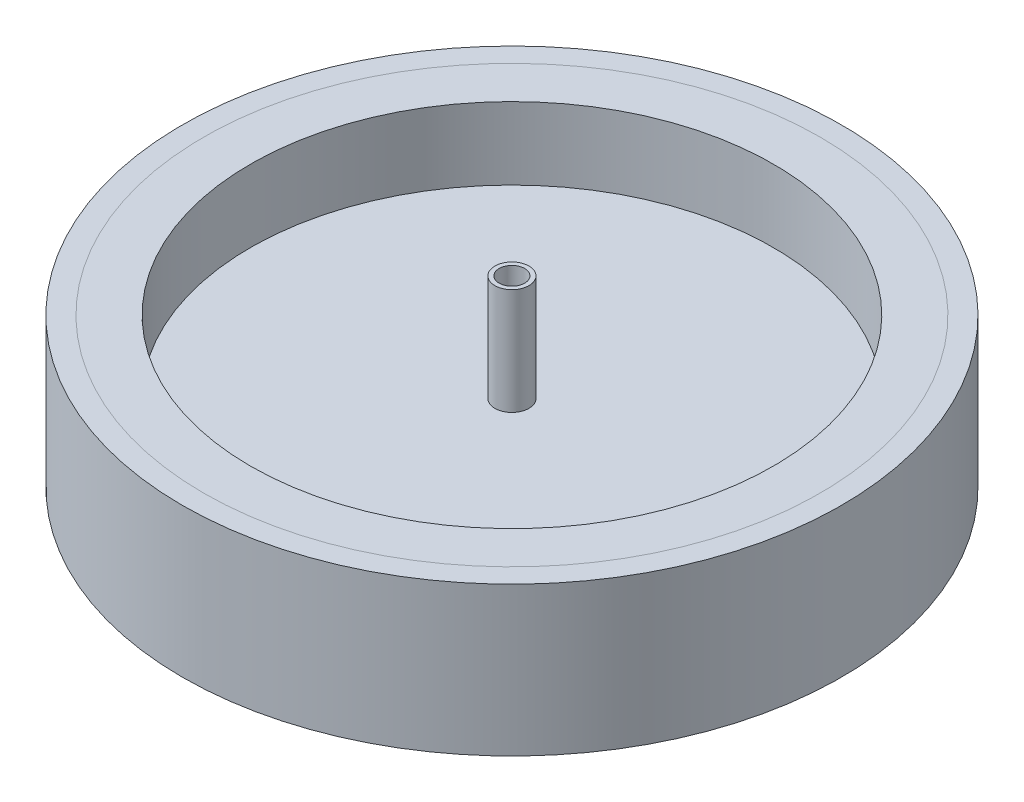
ISO-10303-21;
HEADER;
FILE_DESCRIPTION(('STEP AP214'),'2;1');
FILE_NAME('part.step','',(''),(''),'','','');
FILE_SCHEMA(('AUTOMOTIVE_DESIGN { 1 0 10303 214 1 1 1 1 }'));
ENDSEC;
DATA;
#1=APPLICATION_CONTEXT('core data for automotive mechanical design processes');
#2=APPLICATION_PROTOCOL_DEFINITION('international standard','automotive_design',2000,#1);
#3=PRODUCT_CONTEXT('',#1,'mechanical');
#4=PRODUCT('Part','Part','',(#3));
#5=PRODUCT_RELATED_PRODUCT_CATEGORY('part','',(#4));
#6=PRODUCT_DEFINITION_FORMATION('','',#4);
#7=PRODUCT_DEFINITION_CONTEXT('part definition',#1,'design');
#8=PRODUCT_DEFINITION('design','',#6,#7);
#9=PRODUCT_DEFINITION_SHAPE('','',#8);
#10=(LENGTH_UNIT() NAMED_UNIT(*) SI_UNIT(.MILLI.,.METRE.));
#11=(NAMED_UNIT(*) PLANE_ANGLE_UNIT() SI_UNIT($,.RADIAN.));
#12=(NAMED_UNIT(*) SI_UNIT($,.STERADIAN.) SOLID_ANGLE_UNIT());
#13=UNCERTAINTY_MEASURE_WITH_UNIT(LENGTH_MEASURE(1.E-05),#10,'distance_accuracy_value','');
#14=(GEOMETRIC_REPRESENTATION_CONTEXT(3) GLOBAL_UNCERTAINTY_ASSIGNED_CONTEXT((#13)) GLOBAL_UNIT_ASSIGNED_CONTEXT((#10,
#11,#12)) REPRESENTATION_CONTEXT('',''));
#15=CARTESIAN_POINT('',(0.,0.,0.));
#16=DIRECTION('',(0.,0.,1.));
#17=DIRECTION('',(1.,0.,0.));
#18=AXIS2_PLACEMENT_3D('',#15,#16,#17);
#19=CARTESIAN_POINT('',(-77.5,0.,0.));
#20=DIRECTION('',(0.,-1.,0.));
#21=DIRECTION('',(0.,0.,-1.));
#22=AXIS2_PLACEMENT_3D('',#19,#20,#21);
#23=PLANE('',#22);
#24=CARTESIAN_POINT('',(0.,0.,0.));
#25=DIRECTION('',(0.,1.,0.));
#26=DIRECTION('',(0.,0.,1.));
#27=AXIS2_PLACEMENT_3D('',#24,#25,#26);
#28=CIRCLE('',#27,72.5);
#29=CARTESIAN_POINT('',(0.,0.,72.5));
#30=VERTEX_POINT('',#29);
#31=EDGE_CURVE('E11',#30,#30,#28,.T.);
#32=ORIENTED_EDGE('',*,*,#31,.T.);
#33=EDGE_LOOP('',(#32));
#34=FACE_BOUND('',#33,.T.);
#35=CARTESIAN_POINT('',(0.,0.,0.));
#36=DIRECTION('',(0.,1.,0.));
#37=DIRECTION('',(0.,0.,1.));
#38=AXIS2_PLACEMENT_3D('',#35,#36,#37);
#39=CIRCLE('',#38,77.5);
#40=CARTESIAN_POINT('',(0.,0.,77.5));
#41=VERTEX_POINT('',#40);
#42=EDGE_CURVE('E61',#41,#41,#39,.T.);
#43=ORIENTED_EDGE('',*,*,#42,.F.);
#44=EDGE_LOOP('',(#43));
#45=FACE_BOUND('',#44,.T.);
#46=ADVANCED_FACE('F47',(#34,#45),#23,.T.);
#47=CARTESIAN_POINT('',(0.,40.5434595867115,0.));
#48=DIRECTION('',(0.,1.,0.));
#49=DIRECTION('',(0.,0.,1.));
#50=AXIS2_PLACEMENT_3D('',#47,#48,#49);
#51=CYLINDRICAL_SURFACE('',#50,72.5);
#52=CARTESIAN_POINT('',(0.,35.,0.));
#53=DIRECTION('',(0.,1.,0.));
#54=DIRECTION('',(0.,0.,1.));
#55=AXIS2_PLACEMENT_3D('',#52,#53,#54);
#56=CIRCLE('',#55,72.5);
#57=CARTESIAN_POINT('',(0.,35.,72.5));
#58=VERTEX_POINT('',#57);
#59=EDGE_CURVE('E53',#58,#58,#56,.T.);
#60=ORIENTED_EDGE('',*,*,#59,.T.);
#61=EDGE_LOOP('',(#60));
#62=FACE_BOUND('',#61,.T.);
#63=ORIENTED_EDGE('',*,*,#31,.F.);
#64=EDGE_LOOP('',(#63));
#65=FACE_BOUND('',#64,.T.);
#66=ADVANCED_FACE('F71',(#62,#65),#51,.F.);
#67=CARTESIAN_POINT('',(-72.5,35.,0.));
#68=DIRECTION('',(0.,1.,0.));
#69=DIRECTION('',(0.,0.,1.));
#70=AXIS2_PLACEMENT_3D('',#67,#68,#69);
#71=PLANE('',#70);
#72=CARTESIAN_POINT('',(0.,35.,0.));
#73=DIRECTION('',(0.,1.,0.));
#74=DIRECTION('',(0.,0.,1.));
#75=AXIS2_PLACEMENT_3D('',#72,#73,#74);
#76=CIRCLE('',#75,77.5);
#77=CARTESIAN_POINT('',(0.,35.,77.5));
#78=VERTEX_POINT('',#77);
#79=EDGE_CURVE('E57',#78,#78,#76,.T.);
#80=ORIENTED_EDGE('',*,*,#79,.T.);
#81=EDGE_LOOP('',(#80));
#82=FACE_BOUND('',#81,.T.);
#83=ORIENTED_EDGE('',*,*,#59,.F.);
#84=EDGE_LOOP('',(#83));
#85=FACE_BOUND('',#84,.T.);
#86=ADVANCED_FACE('F75',(#82,#85),#71,.T.);
#87=CARTESIAN_POINT('',(0.,40.5434595867115,0.));
#88=DIRECTION('',(0.,1.,0.));
#89=DIRECTION('',(0.,0.,1.));
#90=AXIS2_PLACEMENT_3D('',#87,#88,#89);
#91=CYLINDRICAL_SURFACE('',#90,77.5);
#92=ORIENTED_EDGE('',*,*,#42,.T.);
#93=EDGE_LOOP('',(#92));
#94=FACE_BOUND('',#93,.T.);
#95=ORIENTED_EDGE('',*,*,#79,.F.);
#96=EDGE_LOOP('',(#95));
#97=FACE_BOUND('',#96,.T.);
#98=ADVANCED_FACE('F67',(#94,#97),#91,.T.);
#99=CLOSED_SHELL('',(#46,#66,#86,#98));
#100=MANIFOLD_SOLID_BREP('B2',#99);
#101=CARTESIAN_POINT('',(0.,35.,0.));
#102=DIRECTION('',(0.,-1.,0.));
#103=DIRECTION('',(0.,0.,-1.));
#104=AXIS2_PLACEMENT_3D('',#101,#102,#103);
#105=CYLINDRICAL_SURFACE('',#104,72.5);
#106=CARTESIAN_POINT('',(0.,35.,0.));
#107=DIRECTION('',(0.,1.,0.));
#108=DIRECTION('',(0.,0.,1.));
#109=AXIS2_PLACEMENT_3D('',#106,#107,#108);
#110=CIRCLE('',#109,72.5);
#111=CARTESIAN_POINT('',(0.,35.,72.5));
#112=VERTEX_POINT('',#111);
#113=EDGE_CURVE('E46',#112,#112,#110,.T.);
#114=ORIENTED_EDGE('',*,*,#113,.F.);
#115=EDGE_LOOP('',(#114));
#116=FACE_BOUND('',#115,.T.);
#117=CARTESIAN_POINT('',(0.,0.,0.));
#118=DIRECTION('',(0.,1.,0.));
#119=DIRECTION('',(0.,0.,1.));
#120=AXIS2_PLACEMENT_3D('',#117,#118,#119);
#121=CIRCLE('',#120,72.5);
#122=CARTESIAN_POINT('',(0.,0.,72.5));
#123=VERTEX_POINT('',#122);
#124=EDGE_CURVE('E112',#123,#123,#121,.T.);
#125=ORIENTED_EDGE('',*,*,#124,.T.);
#126=EDGE_LOOP('',(#125));
#127=FACE_BOUND('',#126,.T.);
#128=ADVANCED_FACE('F109',(#116,#127),#105,.T.);
#129=CARTESIAN_POINT('',(0.,35.,0.));
#130=DIRECTION('',(0.,1.,0.));
#131=DIRECTION('',(0.,0.,1.));
#132=AXIS2_PLACEMENT_3D('',#129,#130,#131);
#133=PLANE('',#132);
#134=CARTESIAN_POINT('',(0.,35.,0.));
#135=DIRECTION('',(0.,1.,0.));
#136=DIRECTION('',(0.,0.,1.));
#137=AXIS2_PLACEMENT_3D('',#134,#135,#136);
#138=CIRCLE('',#137,61.5);
#139=CARTESIAN_POINT('',(0.,35.,61.5));
#140=VERTEX_POINT('',#139);
#141=EDGE_CURVE('E123',#140,#140,#138,.T.);
#142=ORIENTED_EDGE('',*,*,#141,.F.);
#143=EDGE_LOOP('',(#142));
#144=FACE_BOUND('',#143,.T.);
#145=ORIENTED_EDGE('',*,*,#113,.T.);
#146=EDGE_LOOP('',(#145));
#147=FACE_BOUND('',#146,.T.);
#148=ADVANCED_FACE('F180',(#144,#147),#133,.T.);
#149=CARTESIAN_POINT('',(0.,0.,0.));
#150=DIRECTION('',(0.,1.,0.));
#151=DIRECTION('',(0.,0.,1.));
#152=AXIS2_PLACEMENT_3D('',#149,#150,#151);
#153=PLANE('',#152);
#154=ORIENTED_EDGE('',*,*,#124,.F.);
#155=EDGE_LOOP('',(#154));
#156=FACE_BOUND('',#155,.T.);
#157=ADVANCED_FACE('F176',(#156),#153,.F.);
#158=CARTESIAN_POINT('',(0.,18.,0.));
#159=DIRECTION('',(0.,1.,0.));
#160=DIRECTION('',(0.,0.,1.));
#161=AXIS2_PLACEMENT_3D('',#158,#159,#160);
#162=CYLINDRICAL_SURFACE('',#161,61.5);
#163=CARTESIAN_POINT('',(0.,18.,0.));
#164=DIRECTION('',(0.,1.,0.));
#165=DIRECTION('',(0.,0.,1.));
#166=AXIS2_PLACEMENT_3D('',#163,#164,#165);
#167=CIRCLE('',#166,61.5);
#168=CARTESIAN_POINT('',(0.,18.,61.5));
#169=VERTEX_POINT('',#168);
#170=EDGE_CURVE('E121',#169,#169,#167,.T.);
#171=ORIENTED_EDGE('',*,*,#170,.F.);
#172=EDGE_LOOP('',(#171));
#173=FACE_BOUND('',#172,.T.);
#174=ORIENTED_EDGE('',*,*,#141,.T.);
#175=EDGE_LOOP('',(#174));
#176=FACE_BOUND('',#175,.T.);
#177=ADVANCED_FACE('F170',(#173,#176),#162,.F.);
#178=CARTESIAN_POINT('',(0.,18.,0.));
#179=DIRECTION('',(0.,1.,0.));
#180=DIRECTION('',(0.,0.,1.));
#181=AXIS2_PLACEMENT_3D('',#178,#179,#180);
#182=PLANE('',#181);
#183=CARTESIAN_POINT('',(0.,18.,0.));
#184=DIRECTION('',(0.,1.,0.));
#185=DIRECTION('',(0.,0.,1.));
#186=AXIS2_PLACEMENT_3D('',#183,#184,#185);
#187=CIRCLE('',#186,4.);
#188=CARTESIAN_POINT('',(0.,18.,4.));
#189=VERTEX_POINT('',#188);
#190=EDGE_CURVE('E131',#189,#189,#187,.T.);
#191=ORIENTED_EDGE('',*,*,#190,.F.);
#192=EDGE_LOOP('',(#191));
#193=FACE_BOUND('',#192,.T.);
#194=ORIENTED_EDGE('',*,*,#170,.T.);
#195=EDGE_LOOP('',(#194));
#196=FACE_BOUND('',#195,.T.);
#197=ADVANCED_FACE('F164',(#193,#196),#182,.T.);
#198=CARTESIAN_POINT('',(0.,43.,0.));
#199=DIRECTION('',(0.,-1.,0.));
#200=DIRECTION('',(0.,0.,-1.));
#201=AXIS2_PLACEMENT_3D('',#198,#199,#200);
#202=CYLINDRICAL_SURFACE('',#201,4.);
#203=CARTESIAN_POINT('',(0.,43.,0.));
#204=DIRECTION('',(0.,1.,0.));
#205=DIRECTION('',(0.,0.,1.));
#206=AXIS2_PLACEMENT_3D('',#203,#204,#205);
#207=CIRCLE('',#206,4.);
#208=CARTESIAN_POINT('',(0.,43.,4.));
#209=VERTEX_POINT('',#208);
#210=EDGE_CURVE('E127',#209,#209,#207,.T.);
#211=ORIENTED_EDGE('',*,*,#210,.F.);
#212=EDGE_LOOP('',(#211));
#213=FACE_BOUND('',#212,.T.);
#214=ORIENTED_EDGE('',*,*,#190,.T.);
#215=EDGE_LOOP('',(#214));
#216=FACE_BOUND('',#215,.T.);
#217=ADVANCED_FACE('F158',(#213,#216),#202,.T.);
#218=CARTESIAN_POINT('',(0.,43.,0.));
#219=DIRECTION('',(0.,1.,0.));
#220=DIRECTION('',(0.,0.,1.));
#221=AXIS2_PLACEMENT_3D('',#218,#219,#220);
#222=PLANE('',#221);
#223=CARTESIAN_POINT('',(0.,43.,0.));
#224=DIRECTION('',(0.,1.,0.));
#225=DIRECTION('',(0.,0.,1.));
#226=AXIS2_PLACEMENT_3D('',#223,#224,#225);
#227=CIRCLE('',#226,3.);
#228=CARTESIAN_POINT('',(0.,43.,3.));
#229=VERTEX_POINT('',#228);
#230=EDGE_CURVE('E139',#229,#229,#227,.T.);
#231=ORIENTED_EDGE('',*,*,#230,.F.);
#232=EDGE_LOOP('',(#231));
#233=FACE_BOUND('',#232,.T.);
#234=ORIENTED_EDGE('',*,*,#210,.T.);
#235=EDGE_LOOP('',(#234));
#236=FACE_BOUND('',#235,.T.);
#237=ADVANCED_FACE('F152',(#233,#236),#222,.T.);
#238=CARTESIAN_POINT('',(0.,34.,0.));
#239=DIRECTION('',(0.,1.,0.));
#240=DIRECTION('',(0.,0.,1.));
#241=AXIS2_PLACEMENT_3D('',#238,#239,#240);
#242=CYLINDRICAL_SURFACE('',#241,3.);
#243=CARTESIAN_POINT('',(0.,34.,0.));
#244=DIRECTION('',(0.,1.,0.));
#245=DIRECTION('',(0.,0.,1.));
#246=AXIS2_PLACEMENT_3D('',#243,#244,#245);
#247=CIRCLE('',#246,3.);
#248=CARTESIAN_POINT('',(0.,34.,3.));
#249=VERTEX_POINT('',#248);
#250=EDGE_CURVE('E135',#249,#249,#247,.T.);
#251=ORIENTED_EDGE('',*,*,#250,.F.);
#252=EDGE_LOOP('',(#251));
#253=FACE_BOUND('',#252,.T.);
#254=ORIENTED_EDGE('',*,*,#230,.T.);
#255=EDGE_LOOP('',(#254));
#256=FACE_BOUND('',#255,.T.);
#257=ADVANCED_FACE('F149',(#253,#256),#242,.F.);
#258=CARTESIAN_POINT('',(0.,34.,0.));
#259=DIRECTION('',(0.,1.,0.));
#260=DIRECTION('',(0.,0.,1.));
#261=AXIS2_PLACEMENT_3D('',#258,#259,#260);
#262=PLANE('',#261);
#263=ORIENTED_EDGE('',*,*,#250,.T.);
#264=EDGE_LOOP('',(#263));
#265=FACE_BOUND('',#264,.T.);
#266=ADVANCED_FACE('F147',(#265),#262,.T.);
#267=CLOSED_SHELL('',(#128,#148,#157,#177,#197,#217,#237,#257,#266));
#268=MANIFOLD_SOLID_BREP('B6',#267);
#269=ADVANCED_BREP_SHAPE_REPRESENTATION('',(#18,#100,#268),#14);
#270=SHAPE_DEFINITION_REPRESENTATION(#9,#269);
ENDSEC;
END-ISO-10303-21;
